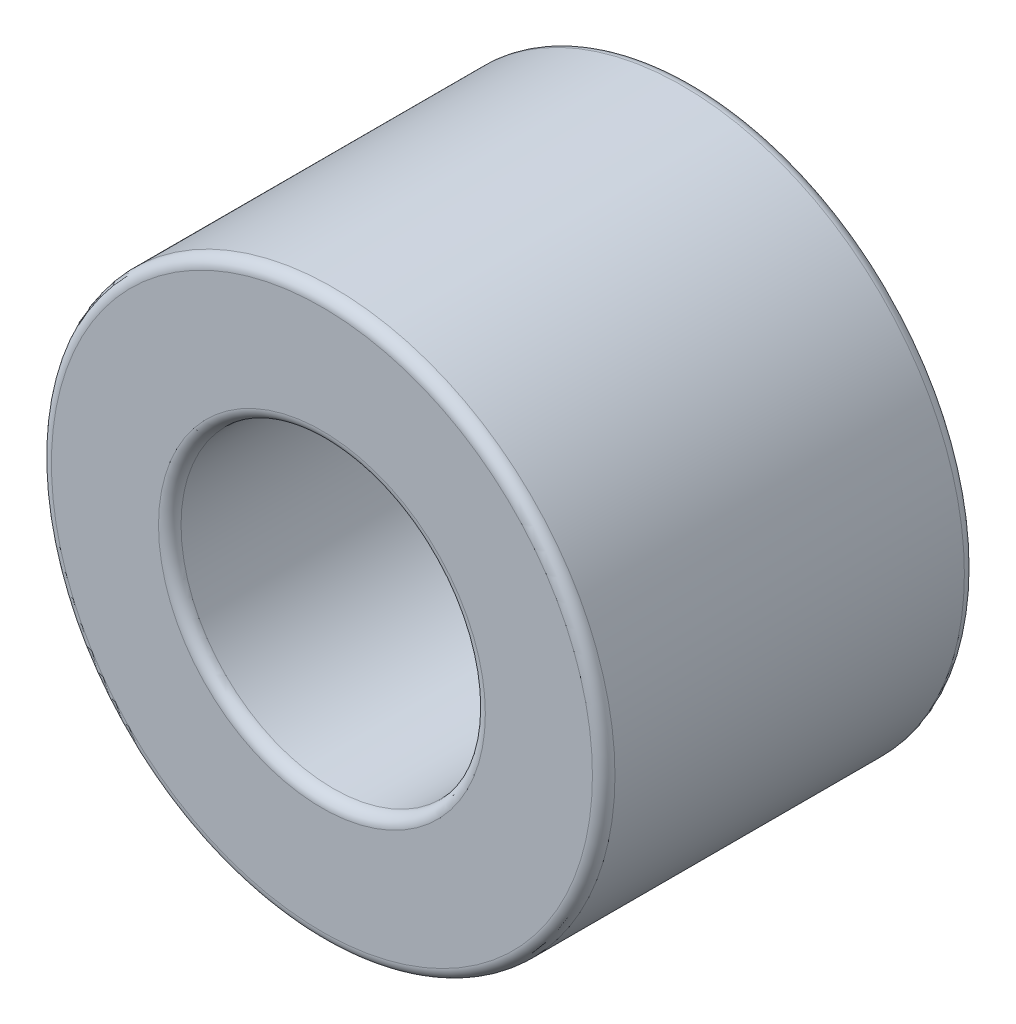
ISO-10303-21;
HEADER;
FILE_DESCRIPTION(('STEP AP214'),'2;1');
FILE_NAME('part.step','',(''),(''),'','','');
FILE_SCHEMA(('AUTOMOTIVE_DESIGN { 1 0 10303 214 1 1 1 1 }'));
ENDSEC;
DATA;
#1=APPLICATION_CONTEXT('core data for automotive mechanical design processes');
#2=APPLICATION_PROTOCOL_DEFINITION('international standard','automotive_design',2000,#1);
#3=PRODUCT_CONTEXT('',#1,'mechanical');
#4=PRODUCT('Part','Part','',(#3));
#5=PRODUCT_RELATED_PRODUCT_CATEGORY('part','',(#4));
#6=PRODUCT_DEFINITION_FORMATION('','',#4);
#7=PRODUCT_DEFINITION_CONTEXT('part definition',#1,'design');
#8=PRODUCT_DEFINITION('design','',#6,#7);
#9=PRODUCT_DEFINITION_SHAPE('','',#8);
#10=(LENGTH_UNIT() NAMED_UNIT(*) SI_UNIT(.MILLI.,.METRE.));
#11=(NAMED_UNIT(*) PLANE_ANGLE_UNIT() SI_UNIT($,.RADIAN.));
#12=(NAMED_UNIT(*) SI_UNIT($,.STERADIAN.) SOLID_ANGLE_UNIT());
#13=UNCERTAINTY_MEASURE_WITH_UNIT(LENGTH_MEASURE(1.E-05),#10,'distance_accuracy_value','');
#14=(GEOMETRIC_REPRESENTATION_CONTEXT(3) GLOBAL_UNCERTAINTY_ASSIGNED_CONTEXT((#13)) GLOBAL_UNIT_ASSIGNED_CONTEXT((#10,
#11,#12)) REPRESENTATION_CONTEXT('',''));
#15=CARTESIAN_POINT('',(0.,0.,0.));
#16=DIRECTION('',(0.,0.,1.));
#17=DIRECTION('',(1.,0.,0.));
#18=AXIS2_PLACEMENT_3D('',#15,#16,#17);
#19=CARTESIAN_POINT('',(0.,0.,4.191));
#20=DIRECTION('',(0.,0.,1.));
#21=DIRECTION('',(1.,0.,0.));
#22=AXIS2_PLACEMENT_3D('',#19,#20,#21);
#23=PLANE('',#22);
#24=CARTESIAN_POINT('',(0.,0.,4.191));
#25=DIRECTION('',(0.,0.,1.));
#26=DIRECTION('',(1.,0.,0.));
#27=AXIS2_PLACEMENT_3D('',#24,#25,#26);
#28=CIRCLE('',#27,3.048);
#29=CARTESIAN_POINT('',(3.048,0.,4.191));
#30=VERTEX_POINT('',#29);
#31=EDGE_CURVE('E10',#30,#30,#28,.T.);
#32=ORIENTED_EDGE('',*,*,#31,.T.);
#33=EDGE_LOOP('',(#32));
#34=FACE_BOUND('',#33,.T.);
#35=CARTESIAN_POINT('',(0.,0.,4.191));
#36=DIRECTION('',(0.,0.,1.));
#37=DIRECTION('',(1.,0.,0.));
#38=AXIS2_PLACEMENT_3D('',#35,#36,#37);
#39=CIRCLE('',#38,1.8415);
#40=CARTESIAN_POINT('',(1.8415,0.,4.191));
#41=VERTEX_POINT('',#40);
#42=EDGE_CURVE('E38',#41,#41,#39,.F.);
#43=ORIENTED_EDGE('',*,*,#42,.T.);
#44=EDGE_LOOP('',(#43));
#45=FACE_BOUND('',#44,.T.);
#46=ADVANCED_FACE('F31',(#34,#45),#23,.T.);
#47=CARTESIAN_POINT('',(0.,0.,0.));
#48=DIRECTION('',(0.,0.,1.));
#49=DIRECTION('',(1.,0.,0.));
#50=AXIS2_PLACEMENT_3D('',#47,#48,#49);
#51=PLANE('',#50);
#52=CARTESIAN_POINT('',(0.,0.,0.));
#53=DIRECTION('',(0.,0.,1.));
#54=DIRECTION('',(1.,0.,0.));
#55=AXIS2_PLACEMENT_3D('',#52,#53,#54);
#56=CIRCLE('',#55,1.8415);
#57=CARTESIAN_POINT('',(1.8415,0.,0.));
#58=VERTEX_POINT('',#57);
#59=EDGE_CURVE('E57',#58,#58,#56,.T.);
#60=ORIENTED_EDGE('',*,*,#59,.T.);
#61=EDGE_LOOP('',(#60));
#62=FACE_BOUND('',#61,.T.);
#63=CARTESIAN_POINT('',(0.,0.,0.));
#64=DIRECTION('',(0.,0.,1.));
#65=DIRECTION('',(1.,0.,0.));
#66=AXIS2_PLACEMENT_3D('',#63,#64,#65);
#67=CIRCLE('',#66,3.048);
#68=CARTESIAN_POINT('',(3.048,0.,0.));
#69=VERTEX_POINT('',#68);
#70=EDGE_CURVE('E60',#69,#69,#67,.F.);
#71=ORIENTED_EDGE('',*,*,#70,.T.);
#72=EDGE_LOOP('',(#71));
#73=FACE_BOUND('',#72,.T.);
#74=ADVANCED_FACE('F64',(#62,#73),#51,.F.);
#75=CARTESIAN_POINT('',(0.,0.,4.191));
#76=DIRECTION('',(0.,0.,-1.));
#77=DIRECTION('',(-1.,0.,0.));
#78=AXIS2_PLACEMENT_3D('',#75,#76,#77);
#79=CYLINDRICAL_SURFACE('',#78,3.175);
#80=CARTESIAN_POINT('',(0.,0.,0.127));
#81=DIRECTION('',(0.,0.,1.));
#82=DIRECTION('',(1.,0.,0.));
#83=AXIS2_PLACEMENT_3D('',#80,#81,#82);
#84=CIRCLE('',#83,3.175);
#85=CARTESIAN_POINT('',(3.175,0.,0.127));
#86=VERTEX_POINT('',#85);
#87=EDGE_CURVE('E42',#86,#86,#84,.T.);
#88=ORIENTED_EDGE('',*,*,#87,.T.);
#89=EDGE_LOOP('',(#88));
#90=FACE_BOUND('',#89,.T.);
#91=CARTESIAN_POINT('',(0.,0.,4.064));
#92=DIRECTION('',(0.,0.,1.));
#93=DIRECTION('',(1.,0.,0.));
#94=AXIS2_PLACEMENT_3D('',#91,#92,#93);
#95=CIRCLE('',#94,3.175);
#96=CARTESIAN_POINT('',(3.175,0.,4.064));
#97=VERTEX_POINT('',#96);
#98=EDGE_CURVE('E46',#97,#97,#95,.F.);
#99=ORIENTED_EDGE('',*,*,#98,.T.);
#100=EDGE_LOOP('',(#99));
#101=FACE_BOUND('',#100,.T.);
#102=ADVANCED_FACE('F74',(#90,#101),#79,.T.);
#103=CARTESIAN_POINT('',(0.,0.,4.191));
#104=DIRECTION('',(0.,0.,-1.));
#105=DIRECTION('',(-1.,0.,0.));
#106=AXIS2_PLACEMENT_3D('',#103,#104,#105);
#107=CYLINDRICAL_SURFACE('',#106,1.7145);
#108=CARTESIAN_POINT('',(0.,0.,0.127));
#109=DIRECTION('',(0.,0.,1.));
#110=DIRECTION('',(1.,0.,0.));
#111=AXIS2_PLACEMENT_3D('',#108,#109,#110);
#112=CIRCLE('',#111,1.7145);
#113=CARTESIAN_POINT('',(1.7145,0.,0.127));
#114=VERTEX_POINT('',#113);
#115=EDGE_CURVE('E51',#114,#114,#112,.F.);
#116=ORIENTED_EDGE('',*,*,#115,.T.);
#117=EDGE_LOOP('',(#116));
#118=FACE_BOUND('',#117,.T.);
#119=CARTESIAN_POINT('',(0.,0.,4.064));
#120=DIRECTION('',(0.,0.,1.));
#121=DIRECTION('',(1.,0.,0.));
#122=AXIS2_PLACEMENT_3D('',#119,#120,#121);
#123=CIRCLE('',#122,1.7145);
#124=CARTESIAN_POINT('',(1.7145,0.,4.064));
#125=VERTEX_POINT('',#124);
#126=EDGE_CURVE('E54',#125,#125,#123,.T.);
#127=ORIENTED_EDGE('',*,*,#126,.T.);
#128=EDGE_LOOP('',(#127));
#129=FACE_BOUND('',#128,.T.);
#130=ADVANCED_FACE('F77',(#118,#129),#107,.F.);
#131=CARTESIAN_POINT('',(0.,0.,0.127));
#132=DIRECTION('',(0.,0.,1.));
#133=DIRECTION('',(1.,0.,0.));
#134=AXIS2_PLACEMENT_3D('',#131,#132,#133);
#135=TOROIDAL_SURFACE('',#134,1.8415,0.127);
#136=ORIENTED_EDGE('',*,*,#115,.F.);
#137=EDGE_LOOP('',(#136));
#138=FACE_BOUND('',#137,.T.);
#139=ORIENTED_EDGE('',*,*,#59,.F.);
#140=EDGE_LOOP('',(#139));
#141=FACE_BOUND('',#140,.T.);
#142=ADVANCED_FACE('F70',(#138,#141),#135,.T.);
#143=CARTESIAN_POINT('',(0.,0.,0.127));
#144=DIRECTION('',(0.,0.,1.));
#145=DIRECTION('',(1.,0.,0.));
#146=AXIS2_PLACEMENT_3D('',#143,#144,#145);
#147=TOROIDAL_SURFACE('',#146,3.048,0.127);
#148=ORIENTED_EDGE('',*,*,#70,.F.);
#149=EDGE_LOOP('',(#148));
#150=FACE_BOUND('',#149,.T.);
#151=ORIENTED_EDGE('',*,*,#87,.F.);
#152=EDGE_LOOP('',(#151));
#153=FACE_BOUND('',#152,.T.);
#154=ADVANCED_FACE('F66',(#150,#153),#147,.T.);
#155=CARTESIAN_POINT('',(0.,0.,4.064));
#156=DIRECTION('',(0.,0.,1.));
#157=DIRECTION('',(1.,0.,0.));
#158=AXIS2_PLACEMENT_3D('',#155,#156,#157);
#159=TOROIDAL_SURFACE('',#158,3.048,0.127);
#160=ORIENTED_EDGE('',*,*,#98,.F.);
#161=EDGE_LOOP('',(#160));
#162=FACE_BOUND('',#161,.T.);
#163=ORIENTED_EDGE('',*,*,#31,.F.);
#164=EDGE_LOOP('',(#163));
#165=FACE_BOUND('',#164,.T.);
#166=ADVANCED_FACE('F69',(#162,#165),#159,.T.);
#167=CARTESIAN_POINT('',(0.,0.,4.064));
#168=DIRECTION('',(0.,0.,1.));
#169=DIRECTION('',(1.,0.,0.));
#170=AXIS2_PLACEMENT_3D('',#167,#168,#169);
#171=TOROIDAL_SURFACE('',#170,1.8415,0.127);
#172=ORIENTED_EDGE('',*,*,#42,.F.);
#173=EDGE_LOOP('',(#172));
#174=FACE_BOUND('',#173,.T.);
#175=ORIENTED_EDGE('',*,*,#126,.F.);
#176=EDGE_LOOP('',(#175));
#177=FACE_BOUND('',#176,.T.);
#178=ADVANCED_FACE('F33',(#174,#177),#171,.T.);
#179=CLOSED_SHELL('',(#46,#74,#102,#130,#142,#154,#166,#178));
#180=MANIFOLD_SOLID_BREP('B2',#179);
#181=ADVANCED_BREP_SHAPE_REPRESENTATION('',(#18,#180),#14);
#182=SHAPE_DEFINITION_REPRESENTATION(#9,#181);
ENDSEC;
END-ISO-10303-21;
